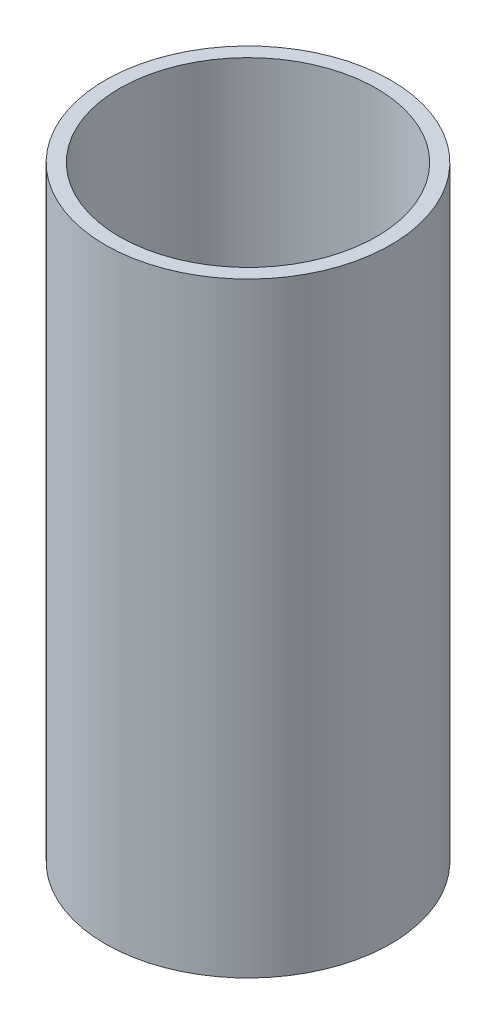
ISO-10303-21;
HEADER;
FILE_DESCRIPTION(('STEP AP214'),'2;1');
FILE_NAME('part.step','',(''),(''),'','','');
FILE_SCHEMA(('AUTOMOTIVE_DESIGN { 1 0 10303 214 1 1 1 1 }'));
ENDSEC;
DATA;
#1=APPLICATION_CONTEXT('core data for automotive mechanical design processes');
#2=APPLICATION_PROTOCOL_DEFINITION('international standard','automotive_design',2000,#1);
#3=PRODUCT_CONTEXT('',#1,'mechanical');
#4=PRODUCT('Part','Part','',(#3));
#5=PRODUCT_RELATED_PRODUCT_CATEGORY('part','',(#4));
#6=PRODUCT_DEFINITION_FORMATION('','',#4);
#7=PRODUCT_DEFINITION_CONTEXT('part definition',#1,'design');
#8=PRODUCT_DEFINITION('design','',#6,#7);
#9=PRODUCT_DEFINITION_SHAPE('','',#8);
#10=(LENGTH_UNIT() NAMED_UNIT(*) SI_UNIT(.MILLI.,.METRE.));
#11=(NAMED_UNIT(*) PLANE_ANGLE_UNIT() SI_UNIT($,.RADIAN.));
#12=(NAMED_UNIT(*) SI_UNIT($,.STERADIAN.) SOLID_ANGLE_UNIT());
#13=UNCERTAINTY_MEASURE_WITH_UNIT(LENGTH_MEASURE(1.E-05),#10,'distance_accuracy_value','');
#14=(GEOMETRIC_REPRESENTATION_CONTEXT(3) GLOBAL_UNCERTAINTY_ASSIGNED_CONTEXT((#13)) GLOBAL_UNIT_ASSIGNED_CONTEXT((#10,
#11,#12)) REPRESENTATION_CONTEXT('',''));
#15=CARTESIAN_POINT('',(0.,0.,0.));
#16=DIRECTION('',(0.,0.,1.));
#17=DIRECTION('',(1.,0.,0.));
#18=AXIS2_PLACEMENT_3D('',#15,#16,#17);
#19=CARTESIAN_POINT('',(0.,106.,0.));
#20=DIRECTION('',(0.,1.,0.));
#21=DIRECTION('',(0.,0.,1.));
#22=AXIS2_PLACEMENT_3D('',#19,#20,#21);
#23=PLANE('',#22);
#24=CARTESIAN_POINT('',(0.,106.,0.));
#25=DIRECTION('',(0.,1.,0.));
#26=DIRECTION('',(0.,0.,1.));
#27=AXIS2_PLACEMENT_3D('',#24,#25,#26);
#28=CIRCLE('',#27,50.);
#29=CARTESIAN_POINT('',(0.,106.,50.));
#30=VERTEX_POINT('',#29);
#31=EDGE_CURVE('E10',#30,#30,#28,.T.);
#32=ORIENTED_EDGE('',*,*,#31,.T.);
#33=EDGE_LOOP('',(#32));
#34=FACE_BOUND('',#33,.T.);
#35=CARTESIAN_POINT('',(0.,106.,0.));
#36=DIRECTION('',(0.,1.,0.));
#37=DIRECTION('',(0.,0.,1.));
#38=AXIS2_PLACEMENT_3D('',#35,#36,#37);
#39=CIRCLE('',#38,45.);
#40=CARTESIAN_POINT('',(0.,106.,45.));
#41=VERTEX_POINT('',#40);
#42=EDGE_CURVE('E50',#41,#41,#39,.T.);
#43=ORIENTED_EDGE('',*,*,#42,.F.);
#44=EDGE_LOOP('',(#43));
#45=FACE_BOUND('',#44,.T.);
#46=ADVANCED_FACE('F39',(#34,#45),#23,.T.);
#47=CARTESIAN_POINT('',(0.,-106.,0.));
#48=DIRECTION('',(0.,1.,0.));
#49=DIRECTION('',(0.,0.,1.));
#50=AXIS2_PLACEMENT_3D('',#47,#48,#49);
#51=PLANE('',#50);
#52=CARTESIAN_POINT('',(0.,-106.,0.));
#53=DIRECTION('',(0.,1.,0.));
#54=DIRECTION('',(0.,0.,1.));
#55=AXIS2_PLACEMENT_3D('',#52,#53,#54);
#56=CIRCLE('',#55,50.);
#57=CARTESIAN_POINT('',(0.,-106.,50.));
#58=VERTEX_POINT('',#57);
#59=EDGE_CURVE('E43',#58,#58,#56,.T.);
#60=ORIENTED_EDGE('',*,*,#59,.F.);
#61=EDGE_LOOP('',(#60));
#62=FACE_BOUND('',#61,.T.);
#63=CARTESIAN_POINT('',(0.,-106.,0.));
#64=DIRECTION('',(0.,1.,0.));
#65=DIRECTION('',(0.,0.,1.));
#66=AXIS2_PLACEMENT_3D('',#63,#64,#65);
#67=CIRCLE('',#66,45.);
#68=CARTESIAN_POINT('',(0.,-106.,45.));
#69=VERTEX_POINT('',#68);
#70=EDGE_CURVE('E52',#69,#69,#67,.T.);
#71=ORIENTED_EDGE('',*,*,#70,.T.);
#72=EDGE_LOOP('',(#71));
#73=FACE_BOUND('',#72,.T.);
#74=ADVANCED_FACE('F62',(#62,#73),#51,.F.);
#75=CARTESIAN_POINT('',(0.,106.,0.));
#76=DIRECTION('',(0.,-1.,0.));
#77=DIRECTION('',(0.,0.,-1.));
#78=AXIS2_PLACEMENT_3D('',#75,#76,#77);
#79=CYLINDRICAL_SURFACE('',#78,50.);
#80=ORIENTED_EDGE('',*,*,#31,.F.);
#81=EDGE_LOOP('',(#80));
#82=FACE_BOUND('',#81,.T.);
#83=ORIENTED_EDGE('',*,*,#59,.T.);
#84=EDGE_LOOP('',(#83));
#85=FACE_BOUND('',#84,.T.);
#86=ADVANCED_FACE('F41',(#82,#85),#79,.T.);
#87=CARTESIAN_POINT('',(0.,106.,0.));
#88=DIRECTION('',(0.,-1.,0.));
#89=DIRECTION('',(0.,0.,-1.));
#90=AXIS2_PLACEMENT_3D('',#87,#88,#89);
#91=CYLINDRICAL_SURFACE('',#90,45.);
#92=ORIENTED_EDGE('',*,*,#42,.T.);
#93=EDGE_LOOP('',(#92));
#94=FACE_BOUND('',#93,.T.);
#95=ORIENTED_EDGE('',*,*,#70,.F.);
#96=EDGE_LOOP('',(#95));
#97=FACE_BOUND('',#96,.T.);
#98=ADVANCED_FACE('F58',(#94,#97),#91,.F.);
#99=CLOSED_SHELL('',(#46,#74,#86,#98));
#100=MANIFOLD_SOLID_BREP('B2',#99);
#101=ADVANCED_BREP_SHAPE_REPRESENTATION('',(#18,#100),#14);
#102=SHAPE_DEFINITION_REPRESENTATION(#9,#101);
ENDSEC;
END-ISO-10303-21;
